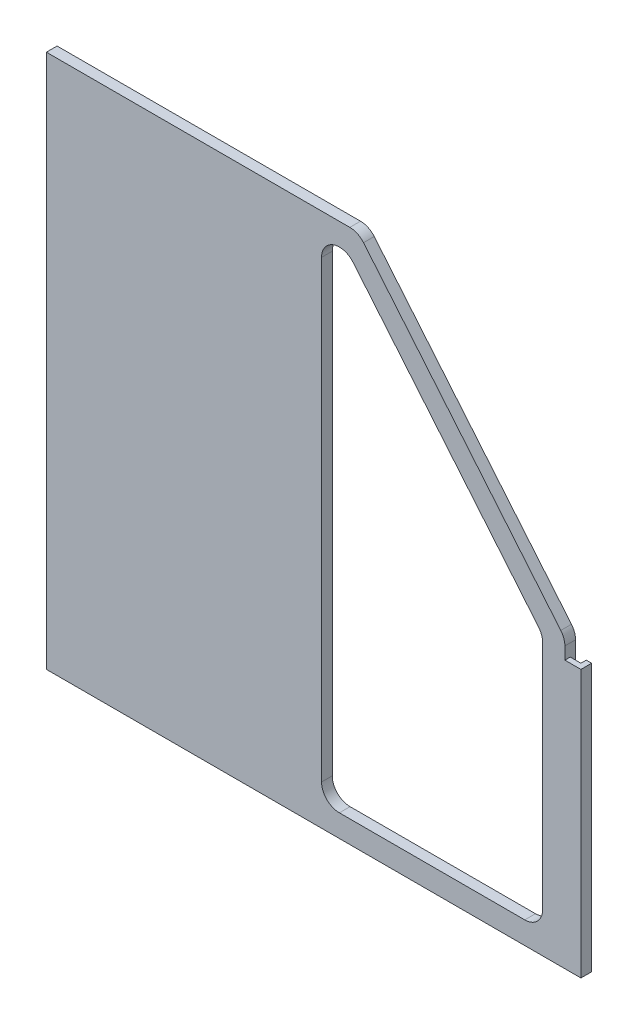
ISO-10303-21;
HEADER;
FILE_DESCRIPTION(('STEP AP214'),'2;1');
FILE_NAME('part.step','',(''),(''),'','','');
FILE_SCHEMA(('AUTOMOTIVE_DESIGN { 1 0 10303 214 1 1 1 1 }'));
ENDSEC;
DATA;
#1=APPLICATION_CONTEXT('core data for automotive mechanical design processes');
#2=APPLICATION_PROTOCOL_DEFINITION('international standard','automotive_design',2000,#1);
#3=PRODUCT_CONTEXT('',#1,'mechanical');
#4=PRODUCT('Part','Part','',(#3));
#5=PRODUCT_RELATED_PRODUCT_CATEGORY('part','',(#4));
#6=PRODUCT_DEFINITION_FORMATION('','',#4);
#7=PRODUCT_DEFINITION_CONTEXT('part definition',#1,'design');
#8=PRODUCT_DEFINITION('design','',#6,#7);
#9=PRODUCT_DEFINITION_SHAPE('','',#8);
#10=(LENGTH_UNIT() NAMED_UNIT(*) SI_UNIT(.MILLI.,.METRE.));
#11=(NAMED_UNIT(*) PLANE_ANGLE_UNIT() SI_UNIT($,.RADIAN.));
#12=(NAMED_UNIT(*) SI_UNIT($,.STERADIAN.) SOLID_ANGLE_UNIT());
#13=UNCERTAINTY_MEASURE_WITH_UNIT(LENGTH_MEASURE(1.E-05),#10,'distance_accuracy_value','');
#14=(GEOMETRIC_REPRESENTATION_CONTEXT(3) GLOBAL_UNCERTAINTY_ASSIGNED_CONTEXT((#13)) GLOBAL_UNIT_ASSIGNED_CONTEXT((#10,
#11,#12)) REPRESENTATION_CONTEXT('',''));
#15=CARTESIAN_POINT('',(0.,0.,0.));
#16=DIRECTION('',(0.,0.,1.));
#17=DIRECTION('',(1.,0.,0.));
#18=AXIS2_PLACEMENT_3D('',#15,#16,#17);
#19=CARTESIAN_POINT('',(30.1845700232221,530.438462092076,-12.));
#20=DIRECTION('',(0.,0.,-1.));
#21=DIRECTION('',(-1.,0.,0.));
#22=AXIS2_PLACEMENT_3D('',#19,#20,#21);
#23=PLANE('',#22);
#24=DIRECTION('',(0.,1.,0.));
#25=VECTOR('',#24,1.);
#26=CARTESIAN_POINT('',(271.564632114863,250.438462092075,-12.));
#27=LINE('',#26,#25);
#28=CARTESIAN_POINT('',(271.564632114863,-49.5615379079245,-12.));
#29=VERTEX_POINT('',#28);
#30=CARTESIAN_POINT('',(271.564632114863,264.225300867468,-12.));
#31=VERTEX_POINT('',#30);
#32=EDGE_CURVE('E272',#29,#31,#27,.T.);
#33=ORIENTED_EDGE('',*,*,#32,.F.);
#34=DIRECTION('',(1.,0.,0.));
#35=VECTOR('',#34,1.);
#36=CARTESIAN_POINT('',(-310.435367885137,-49.5615379079245,-12.));
#37=LINE('',#36,#35);
#38=CARTESIAN_POINT('',(-310.435367885137,-49.5615379079245,-12.));
#39=VERTEX_POINT('',#38);
#40=EDGE_CURVE('E265',#39,#29,#37,.T.);
#41=ORIENTED_EDGE('',*,*,#40,.F.);
#42=DIRECTION('',(0.,-1.,0.));
#43=VECTOR('',#42,1.);
#44=CARTESIAN_POINT('',(-310.435367885137,-49.5615379079245,-12.));
#45=LINE('',#44,#43);
#46=CARTESIAN_POINT('',(-310.435367885137,550.438462092075,-12.));
#47=VERTEX_POINT('',#46);
#48=EDGE_CURVE('E260',#47,#39,#45,.T.);
#49=ORIENTED_EDGE('',*,*,#48,.F.);
#50=DIRECTION('',(-1.,0.,0.));
#51=VECTOR('',#50,1.);
#52=CARTESIAN_POINT('',(-310.435367885137,550.438462092075,-12.));
#53=LINE('',#52,#51);
#54=CARTESIAN_POINT('',(30.1845700232221,550.438462092075,-12.));
#55=VERTEX_POINT('',#54);
#56=EDGE_CURVE('E283',#55,#47,#53,.T.);
#57=ORIENTED_EDGE('',*,*,#56,.F.);
#58=CARTESIAN_POINT('',(30.1845700232221,530.438462092076,-12.));
#59=DIRECTION('',(0.,0.,1.));
#60=DIRECTION('',(-1.,0.,0.));
#61=AXIS2_PLACEMENT_3D('',#58,#59,#60);
#62=CIRCLE('',#61,19.9999999999993);
#63=CARTESIAN_POINT('',(45.5621758663917,543.226317210589,-12.));
#64=VERTEX_POINT('',#63);
#65=EDGE_CURVE('E280',#64,#55,#62,.T.);
#66=ORIENTED_EDGE('',*,*,#65,.F.);
#67=DIRECTION('',(-0.639392755925685,0.768880292158511,0.));
#68=VECTOR('',#67,1.);
#69=CARTESIAN_POINT('',(245.677247378725,302.584656472714,-12.));
#70=LINE('',#69,#68);
#71=CARTESIAN_POINT('',(266.942237958034,277.013155985982,-12.));
#72=VERTEX_POINT('',#71);
#73=EDGE_CURVE('E278',#72,#64,#70,.T.);
#74=ORIENTED_EDGE('',*,*,#73,.F.);
#75=CARTESIAN_POINT('',(251.564632114864,264.225300867468,-12.));
#76=DIRECTION('',(0.,0.,1.));
#77=DIRECTION('',(-1.,0.,0.));
#78=AXIS2_PLACEMENT_3D('',#75,#76,#77);
#79=CIRCLE('',#78,19.9999999999992);
#80=EDGE_CURVE('E275',#31,#72,#79,.T.);
#81=ORIENTED_EDGE('',*,*,#80,.F.);
#82=EDGE_LOOP('',(#33,#41,#49,#57,#66,#74,#81));
#83=FACE_BOUND('',#82,.T.);
#84=CARTESIAN_POINT('',(18.4594924086702,-4.5615379079239,-12.));
#85=DIRECTION('',(0.,0.,1.));
#86=DIRECTION('',(-1.,0.,0.));
#87=AXIS2_PLACEMENT_3D('',#84,#85,#86);
#88=CIRCLE('',#87,19.9999999999993);
#89=CARTESIAN_POINT('',(-1.54050759132906,-4.5615379079239,-12.));
#90=VERTEX_POINT('',#89);
#91=CARTESIAN_POINT('',(18.4594924086702,-24.5615379079232,-12.));
#92=VERTEX_POINT('',#91);
#93=EDGE_CURVE('E197',#90,#92,#88,.T.);
#94=ORIENTED_EDGE('',*,*,#93,.T.);
#95=DIRECTION('',(1.,0.,0.));
#96=VECTOR('',#95,1.);
#97=CARTESIAN_POINT('',(18.4594924086702,-24.5615379079232,-12.));
#98=LINE('',#97,#96);
#99=CARTESIAN_POINT('',(226.564632114864,-24.5615379079231,-12.));
#100=VERTEX_POINT('',#99);
#101=EDGE_CURVE('E200',#92,#100,#98,.T.);
#102=ORIENTED_EDGE('',*,*,#101,.T.);
#103=CARTESIAN_POINT('',(226.564632114864,-4.5615379079239,-12.));
#104=DIRECTION('',(0.,0.,1.));
#105=DIRECTION('',(1.,0.,0.));
#106=AXIS2_PLACEMENT_3D('',#103,#104,#105);
#107=CIRCLE('',#106,19.9999999999993);
#108=CARTESIAN_POINT('',(246.564632114863,-4.5615379079239,-12.));
#109=VERTEX_POINT('',#108);
#110=EDGE_CURVE('E58',#100,#109,#107,.T.);
#111=ORIENTED_EDGE('',*,*,#110,.T.);
#112=DIRECTION('',(0.,1.,0.));
#113=VECTOR('',#112,1.);
#114=CARTESIAN_POINT('',(246.564632114863,-4.5615379079239,-12.));
#115=LINE('',#114,#113);
#116=CARTESIAN_POINT('',(246.564632114863,255.188613100069,-12.));
#117=VERTEX_POINT('',#116);
#118=EDGE_CURVE('E205',#109,#117,#115,.T.);
#119=ORIENTED_EDGE('',*,*,#118,.T.);
#120=CARTESIAN_POINT('',(226.564632114864,255.188613100069,-12.));
#121=DIRECTION('',(0.,0.,1.));
#122=DIRECTION('',(-1.,0.,0.));
#123=AXIS2_PLACEMENT_3D('',#120,#121,#122);
#124=CIRCLE('',#123,19.9999999999993);
#125=CARTESIAN_POINT('',(241.942237958034,267.976468218583,-12.));
#126=VERTEX_POINT('',#125);
#127=EDGE_CURVE('E208',#117,#126,#124,.T.);
#128=ORIENTED_EDGE('',*,*,#127,.T.);
#129=DIRECTION('',(-0.639392755925686,0.768880292158511,0.));
#130=VECTOR('',#129,1.);
#131=CARTESIAN_POINT('',(241.942237958034,267.976468218583,-12.));
#132=LINE('',#131,#130);
#133=CARTESIAN_POINT('',(33.8370982518399,518.226317210589,-12.));
#134=VERTEX_POINT('',#133);
#135=EDGE_CURVE('E211',#126,#134,#132,.T.);
#136=ORIENTED_EDGE('',*,*,#135,.T.);
#137=CARTESIAN_POINT('',(18.4594924086702,505.438462092076,-12.));
#138=DIRECTION('',(0.,0.,1.));
#139=DIRECTION('',(1.,0.,0.));
#140=AXIS2_PLACEMENT_3D('',#137,#138,#139);
#141=CIRCLE('',#140,19.9999999999993);
#142=CARTESIAN_POINT('',(-1.5405075913291,505.438462092076,-12.));
#143=VERTEX_POINT('',#142);
#144=EDGE_CURVE('E214',#134,#143,#141,.T.);
#145=ORIENTED_EDGE('',*,*,#144,.T.);
#146=DIRECTION('',(0.,-1.,0.));
#147=VECTOR('',#146,1.);
#148=CARTESIAN_POINT('',(-1.54050759132906,-4.5615379079239,-12.));
#149=LINE('',#148,#147);
#150=EDGE_CURVE('E217',#143,#90,#149,.T.);
#151=ORIENTED_EDGE('',*,*,#150,.T.);
#152=EDGE_LOOP('',(#94,#102,#111,#119,#128,#136,#145,#151));
#153=FACE_BOUND('',#152,.T.);
#154=ADVANCED_FACE('F33',(#83,#153),#23,.T.);
#155=CARTESIAN_POINT('',(-310.435367885137,-49.5615379079245,-12.));
#156=DIRECTION('',(-1.,0.,0.));
#157=DIRECTION('',(0.,0.,1.));
#158=AXIS2_PLACEMENT_3D('',#155,#156,#157);
#159=PLANE('',#158);
#160=DIRECTION('',(0.,-1.,0.));
#161=VECTOR('',#160,1.);
#162=CARTESIAN_POINT('',(-310.435367885137,-49.5615379079245,0.));
#163=LINE('',#162,#161);
#164=CARTESIAN_POINT('',(-310.435367885137,550.438462092075,0.));
#165=VERTEX_POINT('',#164);
#166=CARTESIAN_POINT('',(-310.435367885137,-49.5615379079245,0.));
#167=VERTEX_POINT('',#166);
#168=EDGE_CURVE('E245',#165,#167,#163,.T.);
#169=ORIENTED_EDGE('',*,*,#168,.F.);
#170=DIRECTION('',(0.,0.,1.));
#171=VECTOR('',#170,1.);
#172=CARTESIAN_POINT('',(-310.435367885137,550.438462092075,-12.));
#173=LINE('',#172,#171);
#174=EDGE_CURVE('E11',#47,#165,#173,.T.);
#175=ORIENTED_EDGE('',*,*,#174,.F.);
#176=ORIENTED_EDGE('',*,*,#48,.T.);
#177=DIRECTION('',(0.,0.,1.));
#178=VECTOR('',#177,1.);
#179=CARTESIAN_POINT('',(-310.435367885137,-49.5615379079245,-12.));
#180=LINE('',#179,#178);
#181=EDGE_CURVE('E37',#39,#167,#180,.T.);
#182=ORIENTED_EDGE('',*,*,#181,.T.);
#183=EDGE_LOOP('',(#169,#175,#176,#182));
#184=FACE_BOUND('',#183,.T.);
#185=ADVANCED_FACE('F35',(#184),#159,.T.);
#186=CARTESIAN_POINT('',(-310.435367885137,550.438462092075,-12.));
#187=DIRECTION('',(0.,1.,0.));
#188=DIRECTION('',(0.,0.,1.));
#189=AXIS2_PLACEMENT_3D('',#186,#187,#188);
#190=PLANE('',#189);
#191=DIRECTION('',(-1.,0.,0.));
#192=VECTOR('',#191,1.);
#193=CARTESIAN_POINT('',(-310.435367885137,550.438462092075,0.));
#194=LINE('',#193,#192);
#195=CARTESIAN_POINT('',(30.1845700232221,550.438462092075,0.));
#196=VERTEX_POINT('',#195);
#197=EDGE_CURVE('E264',#196,#165,#194,.T.);
#198=ORIENTED_EDGE('',*,*,#197,.F.);
#199=DIRECTION('',(0.,0.,1.));
#200=VECTOR('',#199,1.);
#201=CARTESIAN_POINT('',(30.1845700232221,550.438462092075,-12.));
#202=LINE('',#201,#200);
#203=EDGE_CURVE('E42',#55,#196,#202,.T.);
#204=ORIENTED_EDGE('',*,*,#203,.F.);
#205=ORIENTED_EDGE('',*,*,#56,.T.);
#206=ORIENTED_EDGE('',*,*,#174,.T.);
#207=EDGE_LOOP('',(#198,#204,#205,#206));
#208=FACE_BOUND('',#207,.T.);
#209=ADVANCED_FACE('F338',(#208),#190,.T.);
#210=CARTESIAN_POINT('',(30.1845700232221,530.438462092076,-12.));
#211=DIRECTION('',(0.,0.,1.));
#212=DIRECTION('',(1.,0.,0.));
#213=AXIS2_PLACEMENT_3D('',#210,#211,#212);
#214=CYLINDRICAL_SURFACE('',#213,19.9999999999993);
#215=CARTESIAN_POINT('',(30.1845700232221,530.438462092076,0.));
#216=DIRECTION('',(0.,0.,1.));
#217=DIRECTION('',(-1.,0.,0.));
#218=AXIS2_PLACEMENT_3D('',#215,#216,#217);
#219=CIRCLE('',#218,19.9999999999993);
#220=CARTESIAN_POINT('',(45.5621758663917,543.226317210589,0.));
#221=VERTEX_POINT('',#220);
#222=EDGE_CURVE('E306',#221,#196,#219,.T.);
#223=ORIENTED_EDGE('',*,*,#222,.F.);
#224=DIRECTION('',(0.,0.,1.));
#225=VECTOR('',#224,1.);
#226=CARTESIAN_POINT('',(45.5621758663917,543.226317210589,-12.));
#227=LINE('',#226,#225);
#228=EDGE_CURVE('E312',#64,#221,#227,.T.);
#229=ORIENTED_EDGE('',*,*,#228,.F.);
#230=ORIENTED_EDGE('',*,*,#65,.T.);
#231=ORIENTED_EDGE('',*,*,#203,.T.);
#232=EDGE_LOOP('',(#223,#229,#230,#231));
#233=FACE_BOUND('',#232,.T.);
#234=ADVANCED_FACE('F374',(#233),#214,.T.);
#235=CARTESIAN_POINT('',(45.5621758663917,543.226317210589,-12.));
#236=DIRECTION('',(0.768880292158511,0.639392755925685,0.));
#237=DIRECTION('',(-0.639392755925685,0.768880292158511,0.));
#238=AXIS2_PLACEMENT_3D('',#235,#236,#237);
#239=PLANE('',#238);
#240=DIRECTION('',(-0.639392755925685,0.768880292158511,0.));
#241=VECTOR('',#240,1.);
#242=CARTESIAN_POINT('',(45.5621758663917,543.226317210589,0.));
#243=LINE('',#242,#241);
#244=CARTESIAN_POINT('',(266.942237958034,277.013155985982,0.));
#245=VERTEX_POINT('',#244);
#246=EDGE_CURVE('E303',#245,#221,#243,.T.);
#247=ORIENTED_EDGE('',*,*,#246,.F.);
#248=DIRECTION('',(0.,0.,1.));
#249=VECTOR('',#248,1.);
#250=CARTESIAN_POINT('',(266.942237958034,277.013155985982,-12.));
#251=LINE('',#250,#249);
#252=EDGE_CURVE('E314',#72,#245,#251,.T.);
#253=ORIENTED_EDGE('',*,*,#252,.F.);
#254=ORIENTED_EDGE('',*,*,#73,.T.);
#255=ORIENTED_EDGE('',*,*,#228,.T.);
#256=EDGE_LOOP('',(#247,#253,#254,#255));
#257=FACE_BOUND('',#256,.T.);
#258=ADVANCED_FACE('F379',(#257),#239,.T.);
#259=CARTESIAN_POINT('',(251.564632114864,264.225300867468,-12.));
#260=DIRECTION('',(0.,0.,1.));
#261=DIRECTION('',(1.,0.,0.));
#262=AXIS2_PLACEMENT_3D('',#259,#260,#261);
#263=CYLINDRICAL_SURFACE('',#262,19.9999999999992);
#264=CARTESIAN_POINT('',(251.564632114864,264.225300867468,0.));
#265=DIRECTION('',(0.,0.,1.));
#266=DIRECTION('',(-1.,0.,0.));
#267=AXIS2_PLACEMENT_3D('',#264,#265,#266);
#268=CIRCLE('',#267,19.9999999999992);
#269=CARTESIAN_POINT('',(271.564632114863,264.225300867468,0.));
#270=VERTEX_POINT('',#269);
#271=EDGE_CURVE('E300',#270,#245,#268,.T.);
#272=ORIENTED_EDGE('',*,*,#271,.F.);
#273=DIRECTION('',(0.,0.,1.));
#274=VECTOR('',#273,1.);
#275=CARTESIAN_POINT('',(271.564632114863,264.225300867468,-12.));
#276=LINE('',#275,#274);
#277=EDGE_CURVE('E317',#31,#270,#276,.T.);
#278=ORIENTED_EDGE('',*,*,#277,.F.);
#279=ORIENTED_EDGE('',*,*,#80,.T.);
#280=ORIENTED_EDGE('',*,*,#252,.T.);
#281=EDGE_LOOP('',(#272,#278,#279,#280));
#282=FACE_BOUND('',#281,.T.);
#283=ADVANCED_FACE('F385',(#282),#263,.T.);
#284=CARTESIAN_POINT('',(271.564632114863,250.438462092075,-12.));
#285=DIRECTION('',(1.,0.,0.));
#286=DIRECTION('',(0.,0.,-1.));
#287=AXIS2_PLACEMENT_3D('',#284,#285,#286);
#288=PLANE('',#287);
#289=DIRECTION('',(0.,1.,0.));
#290=VECTOR('',#289,1.);
#291=CARTESIAN_POINT('',(271.564632114863,250.438462092075,0.));
#292=LINE('',#291,#290);
#293=CARTESIAN_POINT('',(271.564632114863,250.438462092075,0.));
#294=VERTEX_POINT('',#293);
#295=EDGE_CURVE('E297',#294,#270,#292,.T.);
#296=ORIENTED_EDGE('',*,*,#295,.F.);
#297=DIRECTION('',(0.,0.,1.));
#298=VECTOR('',#297,1.);
#299=CARTESIAN_POINT('',(271.564632114863,250.438462092075,-12.));
#300=LINE('',#299,#298);
#301=CARTESIAN_POINT('',(271.564632114863,250.438462092075,-6.));
#302=VERTEX_POINT('',#301);
#303=EDGE_CURVE('E319',#302,#294,#300,.T.);
#304=ORIENTED_EDGE('',*,*,#303,.F.);
#305=DIRECTION('',(0.,1.,0.));
#306=VECTOR('',#305,1.);
#307=CARTESIAN_POINT('',(271.564632114863,250.438462092075,-6.));
#308=LINE('',#307,#306);
#309=CARTESIAN_POINT('',(271.564632114863,-49.5615379079245,-6.));
#310=VERTEX_POINT('',#309);
#311=EDGE_CURVE('E182',#310,#302,#308,.T.);
#312=ORIENTED_EDGE('',*,*,#311,.F.);
#313=DIRECTION('',(0.,0.,-1.));
#314=VECTOR('',#313,1.);
#315=CARTESIAN_POINT('',(271.564632114863,-49.5615379079245,-6.));
#316=LINE('',#315,#314);
#317=EDGE_CURVE('E192',#310,#29,#316,.T.);
#318=ORIENTED_EDGE('',*,*,#317,.T.);
#319=ORIENTED_EDGE('',*,*,#32,.T.);
#320=ORIENTED_EDGE('',*,*,#277,.T.);
#321=EDGE_LOOP('',(#296,#304,#312,#318,#319,#320));
#322=FACE_BOUND('',#321,.T.);
#323=ADVANCED_FACE('F349',(#322),#288,.T.);
#324=CARTESIAN_POINT('',(271.564632114863,250.438462092075,-12.));
#325=DIRECTION('',(0.,1.,0.));
#326=DIRECTION('',(0.,0.,1.));
#327=AXIS2_PLACEMENT_3D('',#324,#325,#326);
#328=PLANE('',#327);
#329=DIRECTION('',(0.,0.,-1.));
#330=VECTOR('',#329,1.);
#331=CARTESIAN_POINT('',(283.564632114863,250.438462092075,-6.));
#332=LINE('',#331,#330);
#333=CARTESIAN_POINT('',(283.564632114863,250.438462092075,-6.));
#334=VERTEX_POINT('',#333);
#335=CARTESIAN_POINT('',(283.564632114863,250.438462092075,-12.));
#336=VERTEX_POINT('',#335);
#337=EDGE_CURVE('E50',#334,#336,#332,.T.);
#338=ORIENTED_EDGE('',*,*,#337,.F.);
#339=DIRECTION('',(1.,0.,0.));
#340=VECTOR('',#339,1.);
#341=CARTESIAN_POINT('',(283.564632114863,250.438462092075,-6.));
#342=LINE('',#341,#340);
#343=EDGE_CURVE('E177',#302,#334,#342,.T.);
#344=ORIENTED_EDGE('',*,*,#343,.F.);
#345=ORIENTED_EDGE('',*,*,#303,.T.);
#346=DIRECTION('',(-1.,0.,0.));
#347=VECTOR('',#346,1.);
#348=CARTESIAN_POINT('',(271.564632114863,250.438462092075,0.));
#349=LINE('',#348,#347);
#350=CARTESIAN_POINT('',(289.564632114863,250.438462092075,0.));
#351=VERTEX_POINT('',#350);
#352=EDGE_CURVE('E294',#351,#294,#349,.T.);
#353=ORIENTED_EDGE('',*,*,#352,.F.);
#354=DIRECTION('',(0.,0.,1.));
#355=VECTOR('',#354,1.);
#356=CARTESIAN_POINT('',(289.564632114863,250.438462092075,-12.));
#357=LINE('',#356,#355);
#358=CARTESIAN_POINT('',(289.564632114863,250.438462092075,-12.));
#359=VERTEX_POINT('',#358);
#360=EDGE_CURVE('E321',#359,#351,#357,.T.);
#361=ORIENTED_EDGE('',*,*,#360,.F.);
#362=DIRECTION('',(-1.,0.,0.));
#363=VECTOR('',#362,1.);
#364=CARTESIAN_POINT('',(271.564632114863,250.438462092075,-12.));
#365=LINE('',#364,#363);
#366=EDGE_CURVE('E190',#359,#336,#365,.T.);
#367=ORIENTED_EDGE('',*,*,#366,.T.);
#368=EDGE_LOOP('',(#338,#344,#345,#353,#361,#367));
#369=FACE_BOUND('',#368,.T.);
#370=ADVANCED_FACE('F188',(#369),#328,.T.);
#371=CARTESIAN_POINT('',(289.564632114863,-49.5615379079245,-12.));
#372=DIRECTION('',(1.,0.,0.));
#373=DIRECTION('',(0.,1.,0.));
#374=AXIS2_PLACEMENT_3D('',#371,#372,#373);
#375=PLANE('',#374);
#376=DIRECTION('',(0.,1.,0.));
#377=VECTOR('',#376,1.);
#378=CARTESIAN_POINT('',(289.564632114863,-49.5615379079245,0.));
#379=LINE('',#378,#377);
#380=CARTESIAN_POINT('',(289.564632114863,-49.5615379079245,0.));
#381=VERTEX_POINT('',#380);
#382=EDGE_CURVE('E291',#381,#351,#379,.T.);
#383=ORIENTED_EDGE('',*,*,#382,.F.);
#384=DIRECTION('',(0.,0.,1.));
#385=VECTOR('',#384,1.);
#386=CARTESIAN_POINT('',(289.564632114863,-49.5615379079245,-12.));
#387=LINE('',#386,#385);
#388=CARTESIAN_POINT('',(289.564632114863,-49.5615379079245,-12.));
#389=VERTEX_POINT('',#388);
#390=EDGE_CURVE('E322',#389,#381,#387,.T.);
#391=ORIENTED_EDGE('',*,*,#390,.F.);
#392=DIRECTION('',(0.,1.,0.));
#393=VECTOR('',#392,1.);
#394=CARTESIAN_POINT('',(289.564632114863,-49.5615379079245,-12.));
#395=LINE('',#394,#393);
#396=EDGE_CURVE('E268',#389,#359,#395,.T.);
#397=ORIENTED_EDGE('',*,*,#396,.T.);
#398=ORIENTED_EDGE('',*,*,#360,.T.);
#399=EDGE_LOOP('',(#383,#391,#397,#398));
#400=FACE_BOUND('',#399,.T.);
#401=ADVANCED_FACE('F352',(#400),#375,.T.);
#402=CARTESIAN_POINT('',(-310.435367885137,-49.5615379079245,-12.));
#403=DIRECTION('',(0.,-1.,0.));
#404=DIRECTION('',(0.,0.,-1.));
#405=AXIS2_PLACEMENT_3D('',#402,#403,#404);
#406=PLANE('',#405);
#407=ORIENTED_EDGE('',*,*,#317,.F.);
#408=DIRECTION('',(-1.,0.,0.));
#409=VECTOR('',#408,1.);
#410=CARTESIAN_POINT('',(283.564632114863,-49.5615379079245,-6.));
#411=LINE('',#410,#409);
#412=CARTESIAN_POINT('',(283.564632114863,-49.5615379079245,-6.));
#413=VERTEX_POINT('',#412);
#414=EDGE_CURVE('E176',#413,#310,#411,.T.);
#415=ORIENTED_EDGE('',*,*,#414,.F.);
#416=DIRECTION('',(0.,0.,-1.));
#417=VECTOR('',#416,1.);
#418=CARTESIAN_POINT('',(283.564632114863,-49.5615379079245,-6.));
#419=LINE('',#418,#417);
#420=CARTESIAN_POINT('',(283.564632114863,-49.5615379079245,-12.));
#421=VERTEX_POINT('',#420);
#422=EDGE_CURVE('E173',#413,#421,#419,.T.);
#423=ORIENTED_EDGE('',*,*,#422,.T.);
#424=EDGE_CURVE('E263',#421,#389,#37,.T.);
#425=ORIENTED_EDGE('',*,*,#424,.T.);
#426=ORIENTED_EDGE('',*,*,#390,.T.);
#427=DIRECTION('',(1.,0.,0.));
#428=VECTOR('',#427,1.);
#429=CARTESIAN_POINT('',(-310.435367885137,-49.5615379079245,0.));
#430=LINE('',#429,#428);
#431=EDGE_CURVE('E288',#167,#381,#430,.T.);
#432=ORIENTED_EDGE('',*,*,#431,.F.);
#433=ORIENTED_EDGE('',*,*,#181,.F.);
#434=ORIENTED_EDGE('',*,*,#40,.T.);
#435=EDGE_LOOP('',(#407,#415,#423,#425,#426,#432,#433,#434));
#436=FACE_BOUND('',#435,.T.);
#437=ADVANCED_FACE('F332',(#436),#406,.T.);
#438=DIRECTION('',(0.,-1.,0.));
#439=VECTOR('',#438,1.);
#440=CARTESIAN_POINT('',(283.564632114863,250.438462092075,-12.));
#441=LINE('',#440,#439);
#442=EDGE_CURVE('E185',#336,#421,#441,.T.);
#443=ORIENTED_EDGE('',*,*,#442,.F.);
#444=ORIENTED_EDGE('',*,*,#366,.F.);
#445=ORIENTED_EDGE('',*,*,#396,.F.);
#446=ORIENTED_EDGE('',*,*,#424,.F.);
#447=EDGE_LOOP('',(#443,#444,#445,#446));
#448=FACE_BOUND('',#447,.T.);
#449=ADVANCED_FACE('F356',(#448),#23,.T.);
#450=CARTESIAN_POINT('',(30.1845700232221,530.438462092076,0.));
#451=DIRECTION('',(0.,0.,-1.));
#452=DIRECTION('',(-1.,0.,0.));
#453=AXIS2_PLACEMENT_3D('',#450,#451,#452);
#454=PLANE('',#453);
#455=DIRECTION('',(1.,0.,0.));
#456=VECTOR('',#455,1.);
#457=CARTESIAN_POINT('',(18.4594924086702,-24.5615379079232,0.));
#458=LINE('',#457,#456);
#459=CARTESIAN_POINT('',(18.4594924086702,-24.5615379079231,0.));
#460=VERTEX_POINT('',#459);
#461=CARTESIAN_POINT('',(226.564632114864,-24.5615379079232,0.));
#462=VERTEX_POINT('',#461);
#463=EDGE_CURVE('E223',#460,#462,#458,.T.);
#464=ORIENTED_EDGE('',*,*,#463,.F.);
#465=CARTESIAN_POINT('',(18.4594924086702,-4.5615379079239,0.));
#466=DIRECTION('',(0.,0.,1.));
#467=DIRECTION('',(-1.,0.,0.));
#468=AXIS2_PLACEMENT_3D('',#465,#466,#467);
#469=CIRCLE('',#468,19.9999999999993);
#470=CARTESIAN_POINT('',(-1.54050759132906,-4.5615379079239,0.));
#471=VERTEX_POINT('',#470);
#472=EDGE_CURVE('E221',#471,#460,#469,.T.);
#473=ORIENTED_EDGE('',*,*,#472,.F.);
#474=DIRECTION('',(0.,-1.,0.));
#475=VECTOR('',#474,1.);
#476=CARTESIAN_POINT('',(-1.54050759132906,-4.5615379079239,0.));
#477=LINE('',#476,#475);
#478=CARTESIAN_POINT('',(-1.5405075913291,505.438462092076,0.));
#479=VERTEX_POINT('',#478);
#480=EDGE_CURVE('E201',#479,#471,#477,.T.);
#481=ORIENTED_EDGE('',*,*,#480,.F.);
#482=CARTESIAN_POINT('',(18.4594924086702,505.438462092076,0.));
#483=DIRECTION('',(0.,0.,1.));
#484=DIRECTION('',(1.,0.,0.));
#485=AXIS2_PLACEMENT_3D('',#482,#483,#484);
#486=CIRCLE('',#485,19.9999999999993);
#487=CARTESIAN_POINT('',(33.8370982518399,518.226317210589,0.));
#488=VERTEX_POINT('',#487);
#489=EDGE_CURVE('E238',#488,#479,#486,.T.);
#490=ORIENTED_EDGE('',*,*,#489,.F.);
#491=DIRECTION('',(-0.639392755925686,0.768880292158511,0.));
#492=VECTOR('',#491,1.);
#493=CARTESIAN_POINT('',(241.942237958034,267.976468218583,0.));
#494=LINE('',#493,#492);
#495=CARTESIAN_POINT('',(241.942237958034,267.976468218583,0.));
#496=VERTEX_POINT('',#495);
#497=EDGE_CURVE('E235',#496,#488,#494,.T.);
#498=ORIENTED_EDGE('',*,*,#497,.F.);
#499=CARTESIAN_POINT('',(226.564632114864,255.188613100069,0.));
#500=DIRECTION('',(0.,0.,1.));
#501=DIRECTION('',(-1.,0.,0.));
#502=AXIS2_PLACEMENT_3D('',#499,#500,#501);
#503=CIRCLE('',#502,19.9999999999993);
#504=CARTESIAN_POINT('',(246.564632114863,255.188613100069,0.));
#505=VERTEX_POINT('',#504);
#506=EDGE_CURVE('E232',#505,#496,#503,.T.);
#507=ORIENTED_EDGE('',*,*,#506,.F.);
#508=DIRECTION('',(0.,1.,0.));
#509=VECTOR('',#508,1.);
#510=CARTESIAN_POINT('',(246.564632114863,-4.5615379079239,0.));
#511=LINE('',#510,#509);
#512=CARTESIAN_POINT('',(246.564632114863,-4.5615379079239,0.));
#513=VERTEX_POINT('',#512);
#514=EDGE_CURVE('E229',#513,#505,#511,.T.);
#515=ORIENTED_EDGE('',*,*,#514,.F.);
#516=CARTESIAN_POINT('',(226.564632114864,-4.5615379079239,0.));
#517=DIRECTION('',(0.,0.,1.));
#518=DIRECTION('',(1.,0.,0.));
#519=AXIS2_PLACEMENT_3D('',#516,#517,#518);
#520=CIRCLE('',#519,19.9999999999993);
#521=EDGE_CURVE('E226',#462,#513,#520,.T.);
#522=ORIENTED_EDGE('',*,*,#521,.F.);
#523=EDGE_LOOP('',(#464,#473,#481,#490,#498,#507,#515,#522));
#524=FACE_BOUND('',#523,.T.);
#525=ORIENTED_EDGE('',*,*,#168,.T.);
#526=ORIENTED_EDGE('',*,*,#431,.T.);
#527=ORIENTED_EDGE('',*,*,#382,.T.);
#528=ORIENTED_EDGE('',*,*,#352,.T.);
#529=ORIENTED_EDGE('',*,*,#295,.T.);
#530=ORIENTED_EDGE('',*,*,#271,.T.);
#531=ORIENTED_EDGE('',*,*,#246,.T.);
#532=ORIENTED_EDGE('',*,*,#222,.T.);
#533=ORIENTED_EDGE('',*,*,#197,.T.);
#534=EDGE_LOOP('',(#525,#526,#527,#528,#529,#530,#531,#532,#533));
#535=FACE_BOUND('',#534,.T.);
#536=ADVANCED_FACE('F334',(#524,#535),#454,.F.);
#537=CARTESIAN_POINT('',(18.4594924086702,-4.5615379079239,-12.));
#538=DIRECTION('',(0.,0.,1.));
#539=DIRECTION('',(1.,0.,0.));
#540=AXIS2_PLACEMENT_3D('',#537,#538,#539);
#541=CYLINDRICAL_SURFACE('',#540,19.9999999999993);
#542=ORIENTED_EDGE('',*,*,#472,.T.);
#543=DIRECTION('',(0.,0.,1.));
#544=VECTOR('',#543,1.);
#545=CARTESIAN_POINT('',(18.4594924086702,-24.5615379079232,-12.));
#546=LINE('',#545,#544);
#547=EDGE_CURVE('E220',#92,#460,#546,.T.);
#548=ORIENTED_EDGE('',*,*,#547,.F.);
#549=ORIENTED_EDGE('',*,*,#93,.F.);
#550=DIRECTION('',(0.,0.,1.));
#551=VECTOR('',#550,1.);
#552=CARTESIAN_POINT('',(-1.54050759132906,-4.5615379079239,-12.));
#553=LINE('',#552,#551);
#554=EDGE_CURVE('E243',#90,#471,#553,.T.);
#555=ORIENTED_EDGE('',*,*,#554,.T.);
#556=EDGE_LOOP('',(#542,#548,#549,#555));
#557=FACE_BOUND('',#556,.T.);
#558=ADVANCED_FACE('F363',(#557),#541,.F.);
#559=CARTESIAN_POINT('',(-1.54050759132906,-4.5615379079239,-12.));
#560=DIRECTION('',(-1.,0.,0.));
#561=DIRECTION('',(0.,0.,1.));
#562=AXIS2_PLACEMENT_3D('',#559,#560,#561);
#563=PLANE('',#562);
#564=ORIENTED_EDGE('',*,*,#480,.T.);
#565=ORIENTED_EDGE('',*,*,#554,.F.);
#566=ORIENTED_EDGE('',*,*,#150,.F.);
#567=DIRECTION('',(0.,0.,1.));
#568=VECTOR('',#567,1.);
#569=CARTESIAN_POINT('',(-1.5405075913291,505.438462092076,-12.));
#570=LINE('',#569,#568);
#571=EDGE_CURVE('E246',#143,#479,#570,.T.);
#572=ORIENTED_EDGE('',*,*,#571,.T.);
#573=EDGE_LOOP('',(#564,#565,#566,#572));
#574=FACE_BOUND('',#573,.T.);
#575=ADVANCED_FACE('F437',(#574),#563,.F.);
#576=CARTESIAN_POINT('',(18.4594924086702,505.438462092076,-12.));
#577=DIRECTION('',(0.,0.,1.));
#578=DIRECTION('',(1.,0.,0.));
#579=AXIS2_PLACEMENT_3D('',#576,#577,#578);
#580=CYLINDRICAL_SURFACE('',#579,19.9999999999993);
#581=ORIENTED_EDGE('',*,*,#489,.T.);
#582=ORIENTED_EDGE('',*,*,#571,.F.);
#583=ORIENTED_EDGE('',*,*,#144,.F.);
#584=DIRECTION('',(0.,0.,1.));
#585=VECTOR('',#584,1.);
#586=CARTESIAN_POINT('',(33.8370982518399,518.226317210589,-12.));
#587=LINE('',#586,#585);
#588=EDGE_CURVE('E248',#134,#488,#587,.T.);
#589=ORIENTED_EDGE('',*,*,#588,.T.);
#590=EDGE_LOOP('',(#581,#582,#583,#589));
#591=FACE_BOUND('',#590,.T.);
#592=ADVANCED_FACE('F440',(#591),#580,.F.);
#593=CARTESIAN_POINT('',(241.942237958034,267.976468218583,-12.));
#594=DIRECTION('',(0.768880292158511,0.639392755925686,0.));
#595=DIRECTION('',(-0.639392755925686,0.768880292158511,0.));
#596=AXIS2_PLACEMENT_3D('',#593,#594,#595);
#597=PLANE('',#596);
#598=ORIENTED_EDGE('',*,*,#497,.T.);
#599=ORIENTED_EDGE('',*,*,#588,.F.);
#600=ORIENTED_EDGE('',*,*,#135,.F.);
#601=DIRECTION('',(0.,0.,1.));
#602=VECTOR('',#601,1.);
#603=CARTESIAN_POINT('',(241.942237958034,267.976468218583,-12.));
#604=LINE('',#603,#602);
#605=EDGE_CURVE('E250',#126,#496,#604,.T.);
#606=ORIENTED_EDGE('',*,*,#605,.T.);
#607=EDGE_LOOP('',(#598,#599,#600,#606));
#608=FACE_BOUND('',#607,.T.);
#609=ADVANCED_FACE('F444',(#608),#597,.F.);
#610=CARTESIAN_POINT('',(226.564632114864,255.188613100069,-12.));
#611=DIRECTION('',(0.,0.,1.));
#612=DIRECTION('',(1.,0.,0.));
#613=AXIS2_PLACEMENT_3D('',#610,#611,#612);
#614=CYLINDRICAL_SURFACE('',#613,19.9999999999993);
#615=ORIENTED_EDGE('',*,*,#506,.T.);
#616=ORIENTED_EDGE('',*,*,#605,.F.);
#617=ORIENTED_EDGE('',*,*,#127,.F.);
#618=DIRECTION('',(0.,0.,1.));
#619=VECTOR('',#618,1.);
#620=CARTESIAN_POINT('',(246.564632114863,255.188613100069,-12.));
#621=LINE('',#620,#619);
#622=EDGE_CURVE('E252',#117,#505,#621,.T.);
#623=ORIENTED_EDGE('',*,*,#622,.T.);
#624=EDGE_LOOP('',(#615,#616,#617,#623));
#625=FACE_BOUND('',#624,.T.);
#626=ADVANCED_FACE('F448',(#625),#614,.F.);
#627=CARTESIAN_POINT('',(246.564632114863,-4.5615379079239,-12.));
#628=DIRECTION('',(1.,0.,0.));
#629=DIRECTION('',(0.,0.,-1.));
#630=AXIS2_PLACEMENT_3D('',#627,#628,#629);
#631=PLANE('',#630);
#632=ORIENTED_EDGE('',*,*,#514,.T.);
#633=ORIENTED_EDGE('',*,*,#622,.F.);
#634=ORIENTED_EDGE('',*,*,#118,.F.);
#635=DIRECTION('',(0.,0.,1.));
#636=VECTOR('',#635,1.);
#637=CARTESIAN_POINT('',(246.564632114863,-4.5615379079239,-12.));
#638=LINE('',#637,#636);
#639=EDGE_CURVE('E254',#109,#513,#638,.T.);
#640=ORIENTED_EDGE('',*,*,#639,.T.);
#641=EDGE_LOOP('',(#632,#633,#634,#640));
#642=FACE_BOUND('',#641,.T.);
#643=ADVANCED_FACE('F452',(#642),#631,.F.);
#644=CARTESIAN_POINT('',(226.564632114864,-4.5615379079239,-12.));
#645=DIRECTION('',(0.,0.,1.));
#646=DIRECTION('',(1.,0.,0.));
#647=AXIS2_PLACEMENT_3D('',#644,#645,#646);
#648=CYLINDRICAL_SURFACE('',#647,19.9999999999993);
#649=ORIENTED_EDGE('',*,*,#521,.T.);
#650=ORIENTED_EDGE('',*,*,#639,.F.);
#651=ORIENTED_EDGE('',*,*,#110,.F.);
#652=DIRECTION('',(0.,0.,1.));
#653=VECTOR('',#652,1.);
#654=CARTESIAN_POINT('',(226.564632114864,-24.5615379079232,-12.));
#655=LINE('',#654,#653);
#656=EDGE_CURVE('E256',#100,#462,#655,.T.);
#657=ORIENTED_EDGE('',*,*,#656,.T.);
#658=EDGE_LOOP('',(#649,#650,#651,#657));
#659=FACE_BOUND('',#658,.T.);
#660=ADVANCED_FACE('F456',(#659),#648,.F.);
#661=CARTESIAN_POINT('',(18.4594924086702,-24.5615379079232,-12.));
#662=DIRECTION('',(0.,-1.,0.));
#663=DIRECTION('',(1.,0.,0.));
#664=AXIS2_PLACEMENT_3D('',#661,#662,#663);
#665=PLANE('',#664);
#666=ORIENTED_EDGE('',*,*,#463,.T.);
#667=ORIENTED_EDGE('',*,*,#656,.F.);
#668=ORIENTED_EDGE('',*,*,#101,.F.);
#669=ORIENTED_EDGE('',*,*,#547,.T.);
#670=EDGE_LOOP('',(#666,#667,#668,#669));
#671=FACE_BOUND('',#670,.T.);
#672=ADVANCED_FACE('F422',(#671),#665,.F.);
#673=CARTESIAN_POINT('',(283.564632114863,250.438462092075,-6.));
#674=DIRECTION('',(1.,0.,0.));
#675=DIRECTION('',(0.,1.,0.));
#676=AXIS2_PLACEMENT_3D('',#673,#674,#675);
#677=PLANE('',#676);
#678=ORIENTED_EDGE('',*,*,#442,.T.);
#679=ORIENTED_EDGE('',*,*,#422,.F.);
#680=DIRECTION('',(0.,-1.,0.));
#681=VECTOR('',#680,1.);
#682=CARTESIAN_POINT('',(283.564632114863,250.438462092075,-6.));
#683=LINE('',#682,#681);
#684=EDGE_CURVE('E169',#334,#413,#683,.T.);
#685=ORIENTED_EDGE('',*,*,#684,.F.);
#686=ORIENTED_EDGE('',*,*,#337,.T.);
#687=EDGE_LOOP('',(#678,#679,#685,#686));
#688=FACE_BOUND('',#687,.T.);
#689=ADVANCED_FACE('F171',(#688),#677,.F.);
#690=CARTESIAN_POINT('',(0.,0.,-6.));
#691=DIRECTION('',(0.,0.,1.));
#692=DIRECTION('',(1.,0.,0.));
#693=AXIS2_PLACEMENT_3D('',#690,#691,#692);
#694=PLANE('',#693);
#695=ORIENTED_EDGE('',*,*,#343,.T.);
#696=ORIENTED_EDGE('',*,*,#684,.T.);
#697=ORIENTED_EDGE('',*,*,#414,.T.);
#698=ORIENTED_EDGE('',*,*,#311,.T.);
#699=EDGE_LOOP('',(#695,#696,#697,#698));
#700=FACE_BOUND('',#699,.T.);
#701=ADVANCED_FACE('F180',(#700),#694,.F.);
#702=CLOSED_SHELL('',(#154,#185,#209,#234,#258,#283,#323,#370,#401,#437,#449,#536,#558,#575,
#592,#609,#626,#643,#660,#672,#689,#701));
#703=MANIFOLD_SOLID_BREP('B2',#702);
#704=ADVANCED_BREP_SHAPE_REPRESENTATION('',(#18,#703),#14);
#705=SHAPE_DEFINITION_REPRESENTATION(#9,#704);
ENDSEC;
END-ISO-10303-21;
